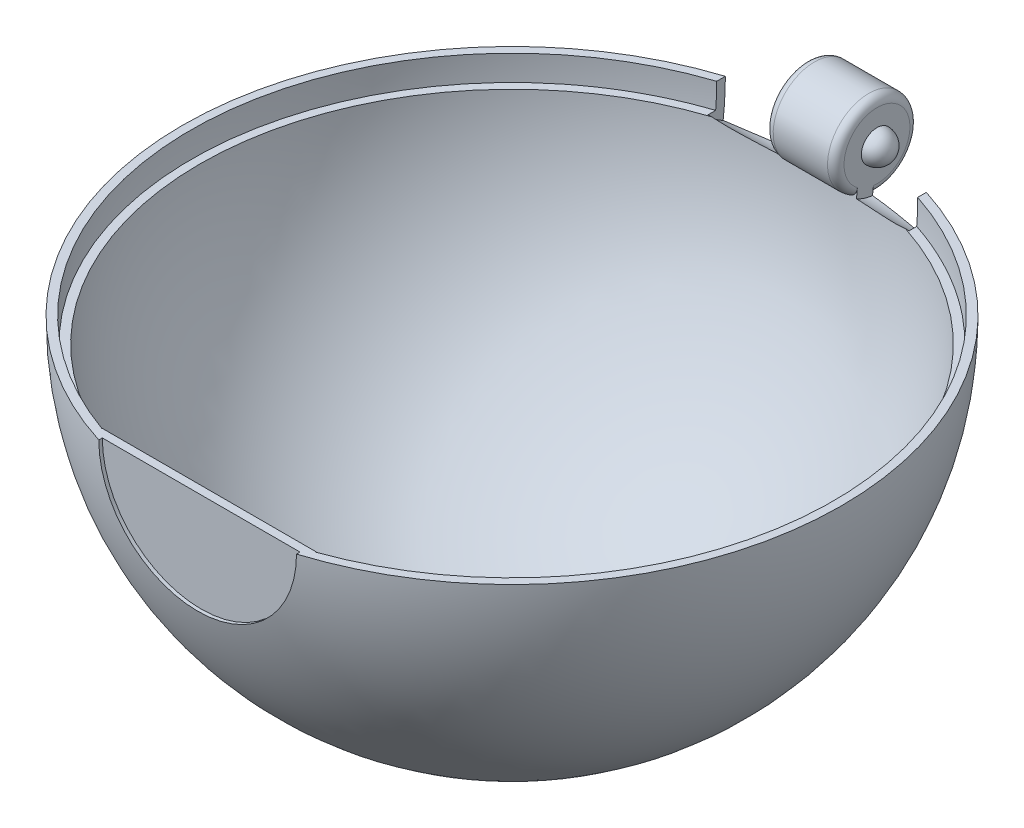
ISO-10303-21;
HEADER;
FILE_DESCRIPTION(('STEP AP214'),'2;1');
FILE_NAME('part.step','',(''),(''),'','','');
FILE_SCHEMA(('AUTOMOTIVE_DESIGN { 1 0 10303 214 1 1 1 1 }'));
ENDSEC;
DATA;
#1=APPLICATION_CONTEXT('core data for automotive mechanical design processes');
#2=APPLICATION_PROTOCOL_DEFINITION('international standard','automotive_design',2000,#1);
#3=PRODUCT_CONTEXT('',#1,'mechanical');
#4=PRODUCT('Part','Part','',(#3));
#5=PRODUCT_RELATED_PRODUCT_CATEGORY('part','',(#4));
#6=PRODUCT_DEFINITION_FORMATION('','',#4);
#7=PRODUCT_DEFINITION_CONTEXT('part definition',#1,'design');
#8=PRODUCT_DEFINITION('design','',#6,#7);
#9=PRODUCT_DEFINITION_SHAPE('','',#8);
#10=(LENGTH_UNIT() NAMED_UNIT(*) SI_UNIT(.MILLI.,.METRE.));
#11=(NAMED_UNIT(*) PLANE_ANGLE_UNIT() SI_UNIT($,.RADIAN.));
#12=(NAMED_UNIT(*) SI_UNIT($,.STERADIAN.) SOLID_ANGLE_UNIT());
#13=UNCERTAINTY_MEASURE_WITH_UNIT(LENGTH_MEASURE(1.E-05),#10,'distance_accuracy_value','');
#14=(GEOMETRIC_REPRESENTATION_CONTEXT(3) GLOBAL_UNCERTAINTY_ASSIGNED_CONTEXT((#13)) GLOBAL_UNIT_ASSIGNED_CONTEXT((#10,
#11,#12)) REPRESENTATION_CONTEXT('',''));
#15=CARTESIAN_POINT('',(0.,0.,0.));
#16=DIRECTION('',(0.,0.,1.));
#17=DIRECTION('',(1.,0.,0.));
#18=AXIS2_PLACEMENT_3D('',#15,#16,#17);
#19=CARTESIAN_POINT('',(12.2,0.,-40.));
#20=DIRECTION('',(-1.,0.,0.));
#21=DIRECTION('',(0.,0.,1.));
#22=AXIS2_PLACEMENT_3D('',#19,#20,#21);
#23=CYLINDRICAL_SURFACE('',#22,5.);
#24=CARTESIAN_POINT('',(-12.2002,-4.50308848326412,-37.8269389995));
#25=CARTESIAN_POINT('',(-11.9978029788796,-4.53286837908402,-37.8886725762478));
#26=CARTESIAN_POINT('',(-11.7946918927189,-4.56046767067175,-37.9490848824753));
#27=CARTESIAN_POINT('',(-11.3871990899398,-4.61175847528687,-38.0671646830625));
#28=CARTESIAN_POINT('',(-11.182817476644,-4.63545030187518,-38.1248323974019));
#29=CARTESIAN_POINT('',(-10.772981780209,-4.67937639575399,-38.2373105963015));
#30=CARTESIAN_POINT('',(-10.5675281062083,-4.69961189499087,-38.2921220940482));
#31=CARTESIAN_POINT('',(-10.1555872190704,-4.73702990258289,-38.3988309760596));
#32=CARTESIAN_POINT('',(-9.94909998135645,-4.7542123379824,-38.4507282906671));
#33=CARTESIAN_POINT('',(-9.32875212664472,-4.80169191712379,-38.6018153853789));
#34=CARTESIAN_POINT('',(-8.91348541270946,-4.82797510119328,-38.6965432388172));
#35=CARTESIAN_POINT('',(-8.07986637585528,-4.87232848053742,-38.8736192314231));
#36=CARTESIAN_POINT('',(-7.66151373954142,-4.89039782964253,-38.9559660945464));
#37=CARTESIAN_POINT('',(-6.83064910080587,-4.92008361099159,-39.1063919448953));
#38=CARTESIAN_POINT('',(-6.4181869278229,-4.93182150519525,-39.1747226447045));
#39=CARTESIAN_POINT('',(-5.59125812798807,-4.95099439805952,-39.2988600394393));
#40=CARTESIAN_POINT('',(-5.17679136627722,-4.95842910304523,-39.3546658794359));
#41=CARTESIAN_POINT('',(-4.34612077072414,-4.97029914935655,-39.4535475234042));
#42=CARTESIAN_POINT('',(-3.92991627665138,-4.9747332214683,-39.4966179361872));
#43=CARTESIAN_POINT('',(-3.09638185349051,-4.9815951328953,-39.5698266550151));
#44=CARTESIAN_POINT('',(-2.67905197770588,-4.98402306561278,-39.599965563096));
#45=CARTESIAN_POINT('',(-1.66010423304868,-4.98838351901832,-39.6575677679463));
#46=CARTESIAN_POINT('',(-1.05807391570866,-4.98962974989821,-39.6780381960944));
#47=CARTESIAN_POINT('',(0.14631129355968,-4.99049316479755,-39.6917661114158));
#48=CARTESIAN_POINT('',(0.748666198931557,-4.99011027516489,-39.6850223682441));
#49=CARTESIAN_POINT('',(1.95251392743705,-4.98737901347728,-39.6443752937921));
#50=CARTESIAN_POINT('',(2.55400666414989,-4.98503045654415,-39.6104694078261));
#51=CARTESIAN_POINT('',(3.75487811173339,-4.97672334475579,-39.5157679227472));
#52=CARTESIAN_POINT('',(4.35425671149382,-4.970764602926,-39.4549709309652));
#53=CARTESIAN_POINT('',(5.56703949555887,-4.95203297150884,-39.3048302243836));
#54=CARTESIAN_POINT('',(6.18034430745905,-4.93906684943935,-39.2147073348568));
#55=CARTESIAN_POINT('',(7.40194251108421,-4.90160126744073,-39.0073019452967));
#56=CARTESIAN_POINT('',(8.01023673073821,-4.87710375345122,-38.8900240294107));
#57=CARTESIAN_POINT('',(8.91789107693872,-4.82703277877957,-38.6945365443468));
#58=CARTESIAN_POINT('',(9.21975138232124,-4.80811255247212,-38.6260844028411));
#59=CARTESIAN_POINT('',(9.82156797546881,-4.76485412578124,-38.4828415793072));
#60=CARTESIAN_POINT('',(10.1215243616813,-4.74051620792088,-38.4080512279315));
#61=CARTESIAN_POINT('',(10.7194449770357,-4.68533411448251,-38.2522862534166));
#62=CARTESIAN_POINT('',(11.0174077868696,-4.65448572644152,-38.1713076480431));
#63=CARTESIAN_POINT('',(11.610809366724,-4.58497548980691,-38.0034660312702));
#64=CARTESIAN_POINT('',(11.9062476516111,-4.54631217312831,-37.9166019162809));
#65=CARTESIAN_POINT('',(12.2002,-4.50308848326412,-37.8269389995));
#66=B_SPLINE_CURVE_WITH_KNOTS('',3,(#24,#25,#26,#27,#28,#29,#30,#31,#32,#33,#34,#35,#36,#37,#38,
#39,#40,#41,#42,#43,#44,#45,#46,#47,#48,#49,#50,#51,#52,#53,#54,#55,#56,#57,#58,#59,#60,#61,#62,
#63,#64,#65),.UNSPECIFIED.,.F.,.F.,(4,2,2,2,2,2,2,2,2,2,2,2,2,2,2,2,2,2,2,2,4),(0.,
0.641033090661753,1.28201471551866,1.9227673949491,2.56353538366316,3.84344675260549,
5.12348994507679,6.37801460615139,7.63262487326515,8.88776548686364,10.1428476600863,
11.9493361069008,13.7559062254524,15.562646277608,17.3694799103701,19.2288886873964,
21.0879837988397,22.0181943870335,22.948356477742,23.8791222656091,24.8100630666374),.UNSPECIFIED.);
#67=CARTESIAN_POINT('',(-3.3,-4.97983288970373,-39.551375));
#68=VERTEX_POINT('',#67);
#69=CARTESIAN_POINT('',(3.30000000000005,-4.97983288970373,-39.551375));
#70=VERTEX_POINT('',#69);
#71=EDGE_CURVE('E193',#68,#70,#66,.T.);
#72=ORIENTED_EDGE('',*,*,#71,.F.);
#73=CARTESIAN_POINT('',(-3.3,0.,-40.));
#74=DIRECTION('',(-1.,0.,0.));
#75=DIRECTION('',(0.,0.,1.));
#76=AXIS2_PLACEMENT_3D('',#73,#74,#75);
#77=CIRCLE('',#76,5.);
#78=CARTESIAN_POINT('',(-3.3,-4.3870944951515,-37.601375));
#79=VERTEX_POINT('',#78);
#80=EDGE_CURVE('E340',#68,#79,#77,.F.);
#81=ORIENTED_EDGE('',*,*,#80,.T.);
#82=CARTESIAN_POINT('',(11.7903349984224,-2.9998,-35.9998500078122));
#83=CARTESIAN_POINT('',(11.6698033300417,-3.0471598250967,-36.0353791801273));
#84=CARTESIAN_POINT('',(11.5483800586359,-3.09242161682977,-36.0706235210669));
#85=CARTESIAN_POINT('',(11.3040092507102,-3.17912423608989,-36.1404283719454));
#86=CARTESIAN_POINT('',(11.1810620199323,-3.22056581640321,-36.1749890155504));
#87=CARTESIAN_POINT('',(10.9339631091742,-3.2999865908136,-36.2432963815458));
#88=CARTESIAN_POINT('',(10.8098125830959,-3.33796879679888,-36.2770437927743));
#89=CARTESIAN_POINT('',(10.5603700243437,-3.41082631607986,-36.3436768030209));
#90=CARTESIAN_POINT('',(10.4350779280139,-3.4457014549376,-36.376562353579));
#91=CARTESIAN_POINT('',(10.0585133967373,-3.54587894896994,-36.4736145395899));
#92=CARTESIAN_POINT('',(9.80575952825097,-3.60698389207323,-36.5363963362957));
#93=CARTESIAN_POINT('',(9.2971458794444,-3.71979454619215,-36.6578474449789));
#94=CARTESIAN_POINT('',(9.04128529779213,-3.77149777476517,-36.7165156682971));
#95=CARTESIAN_POINT('',(8.52652437989094,-3.86701367941325,-36.8295597284223));
#96=CARTESIAN_POINT('',(8.26761839203428,-3.91080787397449,-36.8839253488572));
#97=CARTESIAN_POINT('',(7.74783782893644,-3.99150061183316,-36.9879819138669));
#98=CARTESIAN_POINT('',(7.48696345124716,-4.02839983779433,-37.0376733209885));
#99=CARTESIAN_POINT('',(6.96328279501771,-4.09627856809895,-37.1322665758857));
#100=CARTESIAN_POINT('',(6.7004746980753,-4.12725147641322,-37.1771630626193));
#101=CARTESIAN_POINT('',(6.1734911427201,-4.18399024732575,-37.261968209471));
#102=CARTESIAN_POINT('',(5.90931561902369,-4.20975585892152,-37.3018766291186));
#103=CARTESIAN_POINT('',(5.16574157069302,-4.27571780361929,-37.4068037267221));
#104=CARTESIAN_POINT('',(4.68504978570031,-4.3107352133623,-37.4660313815532));
#105=CARTESIAN_POINT('',(3.72111544160694,-4.36868940836409,-37.5673210327274));
#106=CARTESIAN_POINT('',(3.23787258543864,-4.39162475388225,-37.609380983173));
#107=CARTESIAN_POINT('',(2.26974114930442,-4.42725703227333,-37.6760327102672));
#108=CARTESIAN_POINT('',(1.78485234649039,-4.43995251830193,-37.7006220183372));
#109=CARTESIAN_POINT('',(0.814375308649447,-4.45613969649372,-37.7321530792812));
#110=CARTESIAN_POINT('',(0.328787107520528,-4.45963182063351,-37.7390956604359));
#111=CARTESIAN_POINT('',(-0.642152940387285,-4.4577007565397,-37.7352906012965));
#112=CARTESIAN_POINT('',(-1.1275048138938,-4.45228031455511,-37.7245484102497));
#113=CARTESIAN_POINT('',(-2.09733422536389,-4.43208368688598,-37.6854541721994));
#114=CARTESIAN_POINT('',(-2.58181171778236,-4.41730702719621,-37.6571012330004));
#115=CARTESIAN_POINT('',(-3.54890922177293,-4.37719401082197,-37.5829878967798));
#116=CARTESIAN_POINT('',(-4.03152955552542,-4.35185957753959,-37.5372306705819));
#117=CARTESIAN_POINT('',(-4.99399365465959,-4.28860228178709,-37.4286438976279));
#118=CARTESIAN_POINT('',(-5.47383778239285,-4.25068110166096,-37.3658166326559));
#119=CARTESIAN_POINT('',(-6.20311238741468,-4.18085971246856,-37.2573083611495));
#120=CARTESIAN_POINT('',(-6.45399340907656,-4.15461968383785,-37.2176075046779));
#121=CARTESIAN_POINT('',(-6.95443514021589,-4.09720526923058,-37.1337302693361));
#122=CARTESIAN_POINT('',(-7.20399591334169,-4.06603112340673,-37.0895541083251));
#123=CARTESIAN_POINT('',(-7.70130037776527,-3.99808302120815,-36.9968967824771));
#124=CARTESIAN_POINT('',(-7.94904559693803,-3.96131452647966,-36.9484198354456));
#125=CARTESIAN_POINT('',(-8.44261892102779,-3.88131035256274,-36.8472885041526));
#126=CARTESIAN_POINT('',(-8.68844717696272,-3.83807518834481,-36.7946344526896));
#127=CARTESIAN_POINT('',(-9.17736284429919,-3.74418343577812,-36.6854457503672));
#128=CARTESIAN_POINT('',(-9.42045427552118,-3.69353987161528,-36.6289180004373));
#129=CARTESIAN_POINT('',(-9.90370929069853,-3.58351660856111,-36.5121863899989));
#130=CARTESIAN_POINT('',(-10.1438735615828,-3.52413900379851,-36.4519834127046));
#131=CARTESIAN_POINT('',(-10.6212808452806,-3.39484610278541,-36.3280688545775));
#132=CARTESIAN_POINT('',(-10.858513234466,-3.32490043483353,-36.2643475085096));
#133=CARTESIAN_POINT('',(-11.2108276949945,-3.21058477352361,-36.1666395299786));
#134=CARTESIAN_POINT('',(-11.3277255970325,-3.17089455302755,-36.1337014733556));
#135=CARTESIAN_POINT('',(-11.5601295330384,-3.08803847941264,-36.0672115739014));
#136=CARTESIAN_POINT('',(-11.6756353168284,-3.04487201197586,-36.0336596233967));
#137=CARTESIAN_POINT('',(-11.7903349984224,-2.9998,-35.9998500078122));
#138=B_SPLINE_CURVE_WITH_KNOTS('',3,(#82,#83,#84,#85,#86,#87,#88,#89,#90,#91,#92,#93,#94,#95,
#96,#97,#98,#99,#100,#101,#102,#103,#104,#105,#106,#107,#108,#109,#110,#111,#112,#113,#114,#115,
#116,#117,#118,#119,#120,#121,#122,#123,#124,#125,#126,#127,#128,#129,#130,#131,#132,#133,#134,
#135,#136,#137),.UNSPECIFIED.,.F.,.F.,(4,2,2,2,2,2,2,2,2,2,2,2,2,2,2,2,2,2,2,2,2,2,2,2,2,2,2,4),
(0.,0.402821189354174,0.805562830913803,1.20795040670183,1.61036055924332,2.41260263047595,
3.2150562202793,4.01936135004418,4.82358680414326,5.62870222482475,6.43385644448579,
7.89009303658112,9.3465031196424,10.8031189506139,12.259666411442,13.7157651471317,
15.171937657681,16.6278450004192,18.0835578249579,18.8495477914137,19.6155004871658,
20.3807101413785,21.1458588908537,21.9096783016374,22.6733148718777,23.4391893481291,
23.8224514298369,24.2057813903864),.UNSPECIFIED.);
#139=CARTESIAN_POINT('',(3.3,-4.38709449515069,-37.601375));
#140=VERTEX_POINT('',#139);
#141=EDGE_CURVE('E357',#140,#79,#138,.T.);
#142=ORIENTED_EDGE('',*,*,#141,.F.);
#143=CARTESIAN_POINT('',(3.3,0.,-40.));
#144=DIRECTION('',(1.,0.,0.));
#145=DIRECTION('',(0.,0.,-1.));
#146=AXIS2_PLACEMENT_3D('',#143,#144,#145);
#147=CIRCLE('',#146,5.);
#148=EDGE_CURVE('E177',#140,#70,#147,.F.);
#149=ORIENTED_EDGE('',*,*,#148,.T.);
#150=EDGE_LOOP('',(#72,#81,#142,#149));
#151=FACE_BOUND('',#150,.T.);
#152=ADVANCED_FACE('F35',(#151),#23,.T.);
#153=CARTESIAN_POINT('',(0.,0.,0.));
#154=DIRECTION('',(0.,1.,0.));
#155=DIRECTION('',(-1.,0.,0.));
#156=AXIS2_PLACEMENT_3D('',#153,#154,#155);
#157=SPHERICAL_SURFACE('',#156,38.);
#158=CARTESIAN_POINT('',(0.,-3.,0.));
#159=DIRECTION('',(0.,1.,0.));
#160=DIRECTION('',(-1.,0.,0.));
#161=AXIS2_PLACEMENT_3D('',#158,#159,#160);
#162=CIRCLE('',#161,37.8813938497516);
#163=CARTESIAN_POINT('',(9.26926824772571,-2.99999999999999,36.7298334620742));
#164=VERTEX_POINT('',#163);
#165=CARTESIAN_POINT('',(11.7898261225516,-2.99999999999999,-36.));
#166=VERTEX_POINT('',#165);
#167=EDGE_CURVE('E316',#164,#166,#162,.T.);
#168=ORIENTED_EDGE('',*,*,#167,.T.);
#169=CARTESIAN_POINT('',(4.3,-4.33380137516419,-37.506375));
#170=VERTEX_POINT('',#169);
#171=EDGE_CURVE('E199',#166,#170,#138,.T.);
#172=ORIENTED_EDGE('',*,*,#171,.T.);
#173=CARTESIAN_POINT('',(4.3,0.,0.));
#174=DIRECTION('',(1.,0.,0.));
#175=DIRECTION('',(0.,0.,-1.));
#176=AXIS2_PLACEMENT_3D('',#173,#174,#175);
#177=CIRCLE('',#176,37.7559266870779);
#178=CARTESIAN_POINT('',(4.3,-3.21406965300614,-37.618875));
#179=VERTEX_POINT('',#178);
#180=EDGE_CURVE('E345',#179,#170,#177,.F.);
#181=ORIENTED_EDGE('',*,*,#180,.F.);
#182=CARTESIAN_POINT('',(4.3,-3.21406965300614,-37.618875));
#183=CARTESIAN_POINT('',(4.29999382443238,-3.25651700977552,-37.6152490129872));
#184=CARTESIAN_POINT('',(4.29802484314803,-3.29895297765944,-37.6117760717146));
#185=CARTESIAN_POINT('',(4.29007587705306,-3.38351288913631,-37.6051713269596));
#186=CARTESIAN_POINT('',(4.28409213746157,-3.42563650328096,-37.6020398460161));
#187=CARTESIAN_POINT('',(4.259936455678,-3.5512934407331,-37.5931983320945));
#188=CARTESIAN_POINT('',(4.23555874504061,-3.63379363610894,-37.5880686571521));
#189=CARTESIAN_POINT('',(4.17471510925077,-3.78127377876868,-37.5803036705264));
#190=CARTESIAN_POINT('',(4.14033942479608,-3.84711177273264,-37.5774242771402));
#191=CARTESIAN_POINT('',(4.05974704163706,-3.97098879315224,-37.5733301145246));
#192=CARTESIAN_POINT('',(4.01356634695863,-4.02905072941296,-37.5721103538741));
#193=CARTESIAN_POINT('',(3.91642802635173,-4.12855281618873,-37.5715438383654));
#194=CARTESIAN_POINT('',(3.86664673671067,-4.1711399759873,-37.5719961453405));
#195=CARTESIAN_POINT('',(3.759982235363,-4.24617223042275,-37.5744168478942));
#196=CARTESIAN_POINT('',(3.70310425260987,-4.27862473139152,-37.5763841326771));
#197=CARTESIAN_POINT('',(3.58953809052785,-4.32922126338777,-37.5815987520888));
#198=CARTESIAN_POINT('',(3.53331065587849,-4.34840438465699,-37.584712184462));
#199=CARTESIAN_POINT('',(3.44703057755485,-4.36910767360939,-37.5902881817167));
#200=CARTESIAN_POINT('',(3.41787337144141,-4.37466718218401,-37.5923038971846));
#201=CARTESIAN_POINT('',(3.35916829677394,-4.38299417213709,-37.5966253001039));
#202=CARTESIAN_POINT('',(3.32962022280344,-4.38576012111716,-37.5989311459264));
#203=CARTESIAN_POINT('',(3.29999999999991,-4.38709449514996,-37.601375));
#204=B_SPLINE_CURVE_WITH_KNOTS('',3,(#182,#183,#184,#185,#186,#187,#188,#189,#190,#191,#192,
#193,#194,#195,#196,#197,#198,#199,#200,#201,#202,#203),.UNSPECIFIED.,.F.,.F.,(4,2,2,2,2,2,2,2,
2,2,4),(0.,0.12770668850595,0.255532980792207,0.51213124057193,0.73389585310546,
0.954992013101567,1.15042953315756,1.34572389291169,1.52311225894718,1.61224541709812,
1.70142744245235),.UNSPECIFIED.);
#205=EDGE_CURVE('E267',#179,#140,#204,.T.);
#206=ORIENTED_EDGE('',*,*,#205,.T.);
#207=ORIENTED_EDGE('',*,*,#141,.T.);
#208=CARTESIAN_POINT('',(-3.3,-4.38709449515032,-37.6013750000007));
#209=CARTESIAN_POINT('',(-3.32703791165509,-4.38587571700161,-37.5991442768735));
#210=CARTESIAN_POINT('',(-3.35401640371349,-4.38346523636181,-37.5970283737952));
#211=CARTESIAN_POINT('',(-3.40767099422426,-4.37630895880681,-37.5930370576477));
#212=CARTESIAN_POINT('',(-3.43434719045824,-4.37156394044494,-37.5911615646659));
#213=CARTESIAN_POINT('',(-3.51344515152222,-4.35394775215863,-37.5859250113478));
#214=CARTESIAN_POINT('',(-3.56517346224961,-4.33768398896727,-37.5829343906204));
#215=CARTESIAN_POINT('',(-3.66518888730634,-4.29684776763609,-37.5780044116089));
#216=CARTESIAN_POINT('',(-3.71347893765929,-4.27228250394345,-37.5760641468155));
#217=CARTESIAN_POINT('',(-3.80559071767481,-4.21577275598482,-37.5732306570219));
#218=CARTESIAN_POINT('',(-3.84940942909263,-4.1838233341429,-37.572338135056));
#219=CARTESIAN_POINT('',(-3.9336248738616,-4.11196044744337,-37.57155286815));
#220=CARTESIAN_POINT('',(-3.97375971753678,-4.07174046490814,-37.5717096949507));
#221=CARTESIAN_POINT('',(-4.0474329290686,-3.9856948463685,-37.5730719251486));
#222=CARTESIAN_POINT('',(-4.08097033495082,-3.93986839446075,-37.5742774813226));
#223=CARTESIAN_POINT('',(-4.14382538153291,-3.83941383325623,-37.5778051967758));
#224=CARTESIAN_POINT('',(-4.17246195112133,-3.78436356174225,-37.5802206510116));
#225=CARTESIAN_POINT('',(-4.22112968146229,-3.67060143331793,-37.5860691101143));
#226=CARTESIAN_POINT('',(-4.24115311014913,-3.6118863403864,-37.589503024607));
#227=CARTESIAN_POINT('',(-4.27133871715552,-3.49687370479463,-37.5969521155236));
#228=CARTESIAN_POINT('',(-4.28214040596396,-3.44073707222656,-37.6009023529434));
#229=CARTESIAN_POINT('',(-4.29646576387753,-3.32773862252015,-37.6094377141561));
#230=CARTESIAN_POINT('',(-4.30000881030946,-3.27087914494319,-37.6140211126412));
#231=CARTESIAN_POINT('',(-4.3,-3.21406965300614,-37.618875));
#232=B_SPLINE_CURVE_WITH_KNOTS('',3,(#208,#209,#210,#211,#212,#213,#214,#215,#216,#217,#218,
#219,#220,#221,#222,#223,#224,#225,#226,#227,#228,#229,#230,#231),.UNSPECIFIED.,.F.,.F.,(4,2,2,
2,2,2,2,2,2,2,2,4),(0.,0.0814162794866248,0.162805425553017,0.324878590731014,0.486811654826631,
0.648853313830078,0.818602197335693,0.988375813661809,1.17391511739507,1.3596206349705,
1.53105659382661,1.70203429587768),.UNSPECIFIED.);
#233=CARTESIAN_POINT('',(-4.3,-3.21406965300614,-37.618875));
#234=VERTEX_POINT('',#233);
#235=EDGE_CURVE('E262',#79,#234,#232,.T.);
#236=ORIENTED_EDGE('',*,*,#235,.T.);
#237=CARTESIAN_POINT('',(-4.3,0.,0.));
#238=DIRECTION('',(-1.,0.,0.));
#239=DIRECTION('',(0.,0.,1.));
#240=AXIS2_PLACEMENT_3D('',#237,#238,#239);
#241=CIRCLE('',#240,37.7559266870779);
#242=CARTESIAN_POINT('',(-4.3,-4.33380137516418,-37.506375));
#243=VERTEX_POINT('',#242);
#244=EDGE_CURVE('E59',#243,#234,#241,.F.);
#245=ORIENTED_EDGE('',*,*,#244,.F.);
#246=CARTESIAN_POINT('',(-11.7903349984224,-2.9998,-35.9998500078122));
#247=CARTESIAN_POINT('',(-11.6691380475539,-3.04742099203127,-36.0355753079614));
#248=CARTESIAN_POINT('',(-11.5470398465165,-3.09292095757785,-36.0710125306087));
#249=CARTESIAN_POINT('',(-11.3013038487719,-3.18005975673175,-36.1411949094595));
#250=CARTESIAN_POINT('',(-11.1776663648314,-3.22169936065738,-36.1759402026432));
#251=CARTESIAN_POINT('',(-10.9291750439418,-3.30148209495969,-36.2446070656288));
#252=CARTESIAN_POINT('',(-10.8043223687197,-3.33962825946002,-36.2785293310551));
#253=CARTESIAN_POINT('',(-10.5534655366275,-3.41278430140594,-36.3455012676502));
#254=CARTESIAN_POINT('',(-10.4274613148218,-3.44779400076871,-36.3785508891967));
#255=CARTESIAN_POINT('',(-10.0485803053832,-3.54838211223125,-36.4761211674621));
#256=CARTESIAN_POINT('',(-9.79420734819202,-3.60971758762884,-36.5392370189917));
#257=CARTESIAN_POINT('',(-9.28233206055996,-3.72289991659264,-36.6612982572897));
#258=CARTESIAN_POINT('',(-9.02482894761213,-3.77474434321618,-36.7202425750041));
#259=CARTESIAN_POINT('',(-8.50977634482349,-3.86991622036752,-36.8331175693571));
#260=CARTESIAN_POINT('',(-8.2522497694516,-3.91331872454189,-36.8870899457536));
#261=CARTESIAN_POINT('',(-7.73524932099287,-3.99332304168566,-36.9904092594759));
#262=CARTESIAN_POINT('',(-7.47577559229701,-4.02992535383799,-37.0397565361855));
#263=CARTESIAN_POINT('',(-6.95510594812041,-4.09726016898304,-37.13367882619));
#264=CARTESIAN_POINT('',(-6.69390938694002,-4.12799032465693,-37.1782519279543));
#265=CARTESIAN_POINT('',(-6.17018119014927,-4.18431405196285,-37.2624679072205));
#266=CARTESIAN_POINT('',(-5.90764960293854,-4.20990780846613,-37.3021109621471));
#267=CARTESIAN_POINT('',(-5.53296321013861,-4.24314005928199,-37.3549847308101));
#268=CARTESIAN_POINT('',(-5.42125723668833,-4.25263210603331,-37.3702808748761));
#269=CARTESIAN_POINT('',(-5.19768274458077,-4.27084087316866,-37.3999573356708));
#270=CARTESIAN_POINT('',(-5.0858142628707,-4.27955774812629,-37.4143378348211));
#271=CARTESIAN_POINT('',(-4.86168925394983,-4.2962727645456,-37.4422070016208));
#272=CARTESIAN_POINT('',(-4.74943239583379,-4.30426946515099,-37.4556938677341));
#273=CARTESIAN_POINT('',(-4.52474066070002,-4.31956047543175,-37.4817418455793));
#274=CARTESIAN_POINT('',(-4.41230575257541,-4.32685464434424,-37.4943027716672));
#275=CARTESIAN_POINT('',(-4.2998,-4.33381374568568,-37.5063964995));
#276=B_SPLINE_CURVE_WITH_KNOTS('',3,(#246,#247,#248,#249,#250,#251,#252,#253,#254,#255,#256,
#257,#258,#259,#260,#261,#262,#263,#264,#265,#266,#267,#268,#269,#270,#271,#272,#273,#274,#275),
.UNSPECIFIED.,.F.,.F.,(4,2,2,2,2,2,2,2,2,2,2,2,2,2,4),(0.,0.405043815993187,0.810006632506191,
1.21461432707938,1.61924498000539,2.42646583204607,3.23389280994859,4.03377544943886,
4.83359934857905,5.63374230123474,6.43385644966898,6.77329341266005,7.11266253753095,
7.45269621821546,7.79279788868625),.UNSPECIFIED.);
#277=CARTESIAN_POINT('',(-11.7898261225516,-3.,-36.));
#278=VERTEX_POINT('',#277);
#279=EDGE_CURVE('E185',#278,#243,#276,.T.);
#280=ORIENTED_EDGE('',*,*,#279,.F.);
#281=CARTESIAN_POINT('',(-9.26926824772575,-3.,36.7298334620742));
#282=VERTEX_POINT('',#281);
#283=EDGE_CURVE('E392',#278,#282,#162,.T.);
#284=ORIENTED_EDGE('',*,*,#283,.T.);
#285=CARTESIAN_POINT('',(0.,0.,36.7298334620742));
#286=DIRECTION('',(0.,0.,1.));
#287=DIRECTION('',(1.,0.,0.));
#288=AXIS2_PLACEMENT_3D('',#285,#286,#287);
#289=CIRCLE('',#288,9.74265537973592);
#290=EDGE_CURVE('E384',#282,#164,#289,.T.);
#291=ORIENTED_EDGE('',*,*,#290,.T.);
#292=EDGE_LOOP('',(#168,#172,#181,#206,#207,#236,#245,#280,#284,#291));
#293=FACE_BOUND('',#292,.T.);
#294=ADVANCED_FACE('F219',(#293),#157,.F.);
#295=CARTESIAN_POINT('',(0.,0.,0.));
#296=DIRECTION('',(0.,0.,-1.));
#297=DIRECTION('',(1.,0.,0.));
#298=AXIS2_PLACEMENT_3D('',#295,#296,#297);
#299=SPHERICAL_SURFACE('',#298,39.);
#300=CARTESIAN_POINT('',(-12.2,0.,0.));
#301=DIRECTION('',(1.,0.,0.));
#302=DIRECTION('',(0.,0.,-1.));
#303=AXIS2_PLACEMENT_3D('',#300,#301,#302);
#304=CIRCLE('',#303,37.0426780889287);
#305=CARTESIAN_POINT('',(-12.2,0.,-37.0426780889287));
#306=VERTEX_POINT('',#305);
#307=CARTESIAN_POINT('',(-12.2,-2.99999999999998,-36.9209967362746));
#308=VERTEX_POINT('',#307);
#309=EDGE_CURVE('E367',#306,#308,#304,.F.);
#310=ORIENTED_EDGE('',*,*,#309,.F.);
#311=CARTESIAN_POINT('',(0.,0.,0.));
#312=DIRECTION('',(0.,1.,0.));
#313=DIRECTION('',(0.,0.,1.));
#314=AXIS2_PLACEMENT_3D('',#311,#312,#313);
#315=CIRCLE('',#314,39.);
#316=CARTESIAN_POINT('',(-13.,0.,36.7695526217005));
#317=VERTEX_POINT('',#316);
#318=EDGE_CURVE('E313',#306,#317,#315,.T.);
#319=ORIENTED_EDGE('',*,*,#318,.T.);
#320=CARTESIAN_POINT('',(0.,0.,36.7695526217005));
#321=DIRECTION('',(0.,0.,-1.));
#322=DIRECTION('',(-1.,0.,0.));
#323=AXIS2_PLACEMENT_3D('',#320,#321,#322);
#324=CIRCLE('',#323,13.);
#325=CARTESIAN_POINT('',(-12.6491106406735,-2.99999999999998,36.7695526217005));
#326=VERTEX_POINT('',#325);
#327=EDGE_CURVE('E410',#317,#326,#324,.F.);
#328=ORIENTED_EDGE('',*,*,#327,.T.);
#329=CARTESIAN_POINT('',(0.,-2.99999999999998,0.));
#330=DIRECTION('',(0.,1.,0.));
#331=DIRECTION('',(-1.,0.,0.));
#332=AXIS2_PLACEMENT_3D('',#329,#330,#331);
#333=CIRCLE('',#332,38.8844441904471);
#334=EDGE_CURVE('E383',#308,#326,#333,.T.);
#335=ORIENTED_EDGE('',*,*,#334,.F.);
#336=EDGE_LOOP('',(#310,#319,#328,#335));
#337=FACE_BOUND('',#336,.T.);
#338=ADVANCED_FACE('F246',(#337),#299,.F.);
#339=CARTESIAN_POINT('',(-38.8844441904472,-2.99999999999999,0.));
#340=DIRECTION('',(0.,1.,0.));
#341=DIRECTION('',(-1.,0.,0.));
#342=AXIS2_PLACEMENT_3D('',#339,#340,#341);
#343=PLANE('',#342);
#344=DIRECTION('',(0.,0.,-1.));
#345=VECTOR('',#344,1.);
#346=CARTESIAN_POINT('',(12.2,-2.99999999999999,0.));
#347=LINE('',#346,#345);
#348=CARTESIAN_POINT('',(12.2,-2.99999999999999,-36.));
#349=VERTEX_POINT('',#348);
#350=CARTESIAN_POINT('',(12.2,-2.99999999999998,-36.9209967362746));
#351=VERTEX_POINT('',#350);
#352=EDGE_CURVE('E334',#349,#351,#347,.T.);
#353=ORIENTED_EDGE('',*,*,#352,.F.);
#354=DIRECTION('',(-1.,0.,0.));
#355=VECTOR('',#354,1.);
#356=CARTESIAN_POINT('',(12.2,-2.99999999999999,-36.));
#357=LINE('',#356,#355);
#358=EDGE_CURVE('E335',#349,#166,#357,.T.);
#359=ORIENTED_EDGE('',*,*,#358,.T.);
#360=ORIENTED_EDGE('',*,*,#167,.F.);
#361=DIRECTION('',(1.,0.,0.));
#362=VECTOR('',#361,1.);
#363=CARTESIAN_POINT('',(-38.8844441904472,-2.99999999999999,36.7298334620742));
#364=LINE('',#363,#362);
#365=CARTESIAN_POINT('',(12.6491106406735,-2.99999999999999,36.7298334620742));
#366=VERTEX_POINT('',#365);
#367=EDGE_CURVE('E319',#164,#366,#364,.T.);
#368=ORIENTED_EDGE('',*,*,#367,.T.);
#369=DIRECTION('',(0.,0.,-1.));
#370=VECTOR('',#369,1.);
#371=CARTESIAN_POINT('',(12.6491106406735,-2.99999999999999,37.7298334620742));
#372=LINE('',#371,#370);
#373=CARTESIAN_POINT('',(12.6491106406735,-2.99999999999998,36.7695526217005));
#374=VERTEX_POINT('',#373);
#375=EDGE_CURVE('E325',#374,#366,#372,.T.);
#376=ORIENTED_EDGE('',*,*,#375,.F.);
#377=EDGE_CURVE('E386',#374,#351,#333,.T.);
#378=ORIENTED_EDGE('',*,*,#377,.T.);
#379=EDGE_LOOP('',(#353,#359,#360,#368,#376,#378));
#380=FACE_BOUND('',#379,.T.);
#381=ADVANCED_FACE('F243',(#380),#343,.T.);
#382=ORIENTED_EDGE('',*,*,#283,.F.);
#383=CARTESIAN_POINT('',(-12.2,-2.99999999999999,-36.));
#384=VERTEX_POINT('',#383);
#385=EDGE_CURVE('E331',#278,#384,#357,.T.);
#386=ORIENTED_EDGE('',*,*,#385,.T.);
#387=DIRECTION('',(0.,0.,-1.));
#388=VECTOR('',#387,1.);
#389=CARTESIAN_POINT('',(-12.2,-2.99999999999999,0.));
#390=LINE('',#389,#388);
#391=EDGE_CURVE('E328',#384,#308,#390,.T.);
#392=ORIENTED_EDGE('',*,*,#391,.T.);
#393=ORIENTED_EDGE('',*,*,#334,.T.);
#394=DIRECTION('',(0.,0.,-1.));
#395=VECTOR('',#394,1.);
#396=CARTESIAN_POINT('',(-12.6491106406735,-2.99999999999999,37.7298334620742));
#397=LINE('',#396,#395);
#398=CARTESIAN_POINT('',(-12.6491106406735,-2.99999999999999,36.7298334620742));
#399=VERTEX_POINT('',#398);
#400=EDGE_CURVE('E322',#399,#326,#397,.F.);
#401=ORIENTED_EDGE('',*,*,#400,.F.);
#402=EDGE_CURVE('E321',#399,#282,#364,.T.);
#403=ORIENTED_EDGE('',*,*,#402,.T.);
#404=EDGE_LOOP('',(#382,#386,#392,#393,#401,#403));
#405=FACE_BOUND('',#404,.T.);
#406=ADVANCED_FACE('F245',(#405),#343,.T.);
#407=CARTESIAN_POINT('',(-40.,0.,0.));
#408=DIRECTION('',(0.,1.,0.));
#409=DIRECTION('',(0.,0.,1.));
#410=AXIS2_PLACEMENT_3D('',#407,#408,#409);
#411=PLANE('',#410);
#412=DIRECTION('',(0.,0.,-1.));
#413=VECTOR('',#412,1.);
#414=CARTESIAN_POINT('',(12.2,0.,0.));
#415=LINE('',#414,#413);
#416=CARTESIAN_POINT('',(12.2,0.,-37.0426780889287));
#417=VERTEX_POINT('',#416);
#418=CARTESIAN_POINT('',(12.2,0.,-38.0940940304399));
#419=VERTEX_POINT('',#418);
#420=EDGE_CURVE('E294',#417,#419,#415,.T.);
#421=ORIENTED_EDGE('',*,*,#420,.F.);
#422=CARTESIAN_POINT('',(13.,0.,36.7695526217005));
#423=VERTEX_POINT('',#422);
#424=EDGE_CURVE('E297',#423,#417,#315,.T.);
#425=ORIENTED_EDGE('',*,*,#424,.F.);
#426=DIRECTION('',(0.,0.,-1.));
#427=VECTOR('',#426,1.);
#428=CARTESIAN_POINT('',(13.,0.,37.7298334620742));
#429=LINE('',#428,#427);
#430=CARTESIAN_POINT('',(13.,0.,36.7298334620742));
#431=VERTEX_POINT('',#430);
#432=EDGE_CURVE('E409',#423,#431,#429,.T.);
#433=ORIENTED_EDGE('',*,*,#432,.T.);
#434=DIRECTION('',(-1.,0.,0.));
#435=VECTOR('',#434,1.);
#436=CARTESIAN_POINT('',(-12.,0.,36.7298334620742));
#437=LINE('',#436,#435);
#438=CARTESIAN_POINT('',(-13.,0.,36.7298334620742));
#439=VERTEX_POINT('',#438);
#440=EDGE_CURVE('E389',#431,#439,#437,.T.);
#441=ORIENTED_EDGE('',*,*,#440,.T.);
#442=DIRECTION('',(0.,0.,-1.));
#443=VECTOR('',#442,1.);
#444=CARTESIAN_POINT('',(-13.,0.,37.7298334620742));
#445=LINE('',#444,#443);
#446=EDGE_CURVE('E406',#317,#439,#445,.T.);
#447=ORIENTED_EDGE('',*,*,#446,.F.);
#448=ORIENTED_EDGE('',*,*,#318,.F.);
#449=DIRECTION('',(0.,0.,-1.));
#450=VECTOR('',#449,1.);
#451=CARTESIAN_POINT('',(-12.2,0.,0.));
#452=LINE('',#451,#450);
#453=CARTESIAN_POINT('',(-12.2,0.,-38.0940940304399));
#454=VERTEX_POINT('',#453);
#455=EDGE_CURVE('E364',#306,#454,#452,.T.);
#456=ORIENTED_EDGE('',*,*,#455,.T.);
#457=CARTESIAN_POINT('',(0.,0.,0.));
#458=DIRECTION('',(0.,1.,0.));
#459=DIRECTION('',(0.,0.,1.));
#460=AXIS2_PLACEMENT_3D('',#457,#458,#459);
#461=CIRCLE('',#460,40.);
#462=CARTESIAN_POINT('',(-12.,0.,38.1575680566778));
#463=VERTEX_POINT('',#462);
#464=EDGE_CURVE('E312',#454,#463,#461,.T.);
#465=ORIENTED_EDGE('',*,*,#464,.T.);
#466=DIRECTION('',(0.,0.,1.));
#467=VECTOR('',#466,1.);
#468=CARTESIAN_POINT('',(-12.,0.,37.7298334620742));
#469=LINE('',#468,#467);
#470=CARTESIAN_POINT('',(-12.,0.,37.7298334620742));
#471=VERTEX_POINT('',#470);
#472=EDGE_CURVE('E408',#471,#463,#469,.T.);
#473=ORIENTED_EDGE('',*,*,#472,.F.);
#474=DIRECTION('',(-1.,0.,0.));
#475=VECTOR('',#474,1.);
#476=CARTESIAN_POINT('',(-12.,0.,37.7298334620742));
#477=LINE('',#476,#475);
#478=CARTESIAN_POINT('',(12.,0.,37.7298334620742));
#479=VERTEX_POINT('',#478);
#480=EDGE_CURVE('E417',#479,#471,#477,.T.);
#481=ORIENTED_EDGE('',*,*,#480,.F.);
#482=DIRECTION('',(0.,0.,1.));
#483=VECTOR('',#482,1.);
#484=CARTESIAN_POINT('',(12.,0.,37.7298334620742));
#485=LINE('',#484,#483);
#486=CARTESIAN_POINT('',(12.,0.,38.1575680566778));
#487=VERTEX_POINT('',#486);
#488=EDGE_CURVE('E420',#479,#487,#485,.T.);
#489=ORIENTED_EDGE('',*,*,#488,.T.);
#490=EDGE_CURVE('E301',#487,#419,#461,.T.);
#491=ORIENTED_EDGE('',*,*,#490,.T.);
#492=EDGE_LOOP('',(#421,#425,#433,#441,#447,#448,#456,#465,#473,#481,#489,#491));
#493=FACE_BOUND('',#492,.T.);
#494=ADVANCED_FACE('F282',(#493),#411,.T.);
#495=CARTESIAN_POINT('',(0.,0.,0.));
#496=DIRECTION('',(0.,1.,0.));
#497=DIRECTION('',(-1.,0.,0.));
#498=AXIS2_PLACEMENT_3D('',#495,#496,#497);
#499=SPHERICAL_SURFACE('',#498,40.);
#500=CARTESIAN_POINT('',(12.2,0.,0.));
#501=DIRECTION('',(1.,0.,0.));
#502=DIRECTION('',(0.,0.,-1.));
#503=AXIS2_PLACEMENT_3D('',#500,#501,#502);
#504=CIRCLE('',#503,38.0940940304399);
#505=CARTESIAN_POINT('',(12.2,-4.50311791984176,-37.827));
#506=VERTEX_POINT('',#505);
#507=EDGE_CURVE('E303',#419,#506,#504,.F.);
#508=ORIENTED_EDGE('',*,*,#507,.F.);
#509=ORIENTED_EDGE('',*,*,#490,.F.);
#510=CARTESIAN_POINT('',(0.,0.,38.1575680566778));
#511=DIRECTION('',(0.,0.,-1.));
#512=DIRECTION('',(-1.,0.,0.));
#513=AXIS2_PLACEMENT_3D('',#510,#511,#512);
#514=CIRCLE('',#513,12.);
#515=EDGE_CURVE('E381',#463,#487,#514,.F.);
#516=ORIENTED_EDGE('',*,*,#515,.F.);
#517=ORIENTED_EDGE('',*,*,#464,.F.);
#518=CARTESIAN_POINT('',(-12.2,0.,0.));
#519=DIRECTION('',(1.,0.,0.));
#520=DIRECTION('',(0.,0.,-1.));
#521=AXIS2_PLACEMENT_3D('',#518,#519,#520);
#522=CIRCLE('',#521,38.0940940304399);
#523=CARTESIAN_POINT('',(-12.2,-4.50311791984176,-37.827));
#524=VERTEX_POINT('',#523);
#525=EDGE_CURVE('E191',#454,#524,#522,.F.);
#526=ORIENTED_EDGE('',*,*,#525,.T.);
#527=CARTESIAN_POINT('',(-4.3,-4.97035932899976,-39.456375));
#528=VERTEX_POINT('',#527);
#529=EDGE_CURVE('E183',#524,#528,#66,.T.);
#530=ORIENTED_EDGE('',*,*,#529,.T.);
#531=CARTESIAN_POINT('',(-4.3,0.,0.));
#532=DIRECTION('',(-1.,0.,0.));
#533=DIRECTION('',(0.,0.,1.));
#534=AXIS2_PLACEMENT_3D('',#531,#532,#533);
#535=CIRCLE('',#534,39.7682033790816);
#536=CARTESIAN_POINT('',(-4.3,-3.97669853451013,-39.568875));
#537=VERTEX_POINT('',#536);
#538=EDGE_CURVE('E169',#537,#528,#535,.T.);
#539=ORIENTED_EDGE('',*,*,#538,.F.);
#540=CARTESIAN_POINT('',(-4.3,-3.97669853451013,-39.568875));
#541=CARTESIAN_POINT('',(-4.29999985817323,-4.00463166490049,-39.5660677124383));
#542=CARTESIAN_POINT('',(-4.29881711825768,-4.03256117517808,-39.5633594163417));
#543=CARTESIAN_POINT('',(-4.29409937031828,-4.08823928836967,-39.5581571645056));
#544=CARTESIAN_POINT('',(-4.290564494927,-4.11598790139507,-39.5556631966895));
#545=CARTESIAN_POINT('',(-4.27646720041074,-4.19861085894572,-39.5485351247163));
#546=CARTESIAN_POINT('',(-4.262412008968,-4.25296056450676,-39.544244987384));
#547=CARTESIAN_POINT('',(-4.2253862424254,-4.35860540310081,-39.5367148729621));
#548=CARTESIAN_POINT('',(-4.20241175208464,-4.4098991832748,-39.5334753582047));
#549=CARTESIAN_POINT('',(-4.14821012755402,-4.5079865690165,-39.5281362368825));
#550=CARTESIAN_POINT('',(-4.11698420751326,-4.55478083528059,-39.5260364627505));
#551=CARTESIAN_POINT('',(-4.04711991574043,-4.64261703134008,-39.5230323259261));
#552=CARTESIAN_POINT('',(-4.00847069223203,-4.683650385619,-39.5221297287929));
#553=CARTESIAN_POINT('',(-3.92488104346614,-4.75874081372458,-39.5215492004993));
#554=CARTESIAN_POINT('',(-3.87993939139282,-4.79279652394382,-39.5218715084761));
#555=CARTESIAN_POINT('',(-3.78492477335839,-4.85304819398979,-39.523732651669));
#556=CARTESIAN_POINT('',(-3.73483849339569,-4.87922303435596,-39.5252747162702));
#557=CARTESIAN_POINT('',(-3.63106054366322,-4.92284971758485,-39.5295347592244));
#558=CARTESIAN_POINT('',(-3.57737084206434,-4.94030627904566,-39.5322520999928));
#559=CARTESIAN_POINT('',(-3.48614261659737,-4.96174818154868,-39.5376944174977));
#560=CARTESIAN_POINT('',(-3.44916440681275,-4.9682822791062,-39.5401169145285));
#561=CARTESIAN_POINT('',(-3.37479523198396,-4.9771852481039,-39.5454143196172));
#562=CARTESIAN_POINT('',(-3.33740492300511,-4.97955998404579,-39.5482885844585));
#563=CARTESIAN_POINT('',(-3.3,-4.97983288970373,-39.551375));
#564=B_SPLINE_CURVE_WITH_KNOTS('',3,(#540,#541,#542,#543,#544,#545,#546,#547,#548,#549,#550,
#551,#552,#553,#554,#555,#556,#557,#558,#559,#560,#561,#562,#563),.UNSPECIFIED.,.F.,.F.,(4,2,2,
2,2,2,2,2,2,2,2,4),(0.,0.0841696630725158,0.16833458037533,0.336371981619358,0.504483228594705,
0.672569752754672,0.840903891022244,1.00927089470954,1.178085159118,1.34680795682073,
1.45947490905315,1.57198287798575),.UNSPECIFIED.);
#565=EDGE_CURVE('E268',#537,#68,#564,.T.);
#566=ORIENTED_EDGE('',*,*,#565,.T.);
#567=ORIENTED_EDGE('',*,*,#71,.T.);
#568=CARTESIAN_POINT('',(3.3,-4.97983288970369,-39.5513749999996));
#569=CARTESIAN_POINT('',(3.32816377709923,-4.97962335628892,-39.5490515102259));
#570=CARTESIAN_POINT('',(3.3563151027918,-4.97822805969023,-39.5468480583126));
#571=CARTESIAN_POINT('',(3.41241880087554,-4.97307879506875,-39.5426944440019));
#572=CARTESIAN_POINT('',(3.44037118146689,-4.96932492483833,-39.540744271107));
#573=CARTESIAN_POINT('',(3.52358469117215,-4.95456011614658,-39.5352989522277));
#574=CARTESIAN_POINT('',(3.5782921992848,-4.94004522562982,-39.5322015885809));
#575=CARTESIAN_POINT('',(3.68456554027213,-4.9020682735783,-39.5271666060173));
#576=CARTESIAN_POINT('',(3.73612975022331,-4.87860163477258,-39.525229581718));
#577=CARTESIAN_POINT('',(3.83464330383114,-4.82338305159526,-39.5225717070545));
#578=CARTESIAN_POINT('',(3.88159355542909,-4.79163274180874,-39.5218506169639));
#579=CARTESIAN_POINT('',(3.96948407605753,-4.72078468009009,-39.5216468690311));
#580=CARTESIAN_POINT('',(4.01043155435707,-4.68169587251531,-39.5221627124977));
#581=CARTESIAN_POINT('',(4.08522026456763,-4.59724003411382,-39.5244170368377));
#582=CARTESIAN_POINT('',(4.11906012520376,-4.55187179459018,-39.5261557533595));
#583=CARTESIAN_POINT('',(4.17858279588995,-4.45625946788304,-39.5308027836346));
#584=CARTESIAN_POINT('',(4.20428256001751,-4.40602580330628,-39.5337086374564));
#585=CARTESIAN_POINT('',(4.24686874946575,-4.30203693868269,-39.5406088423359));
#586=CARTESIAN_POINT('',(4.26376066981439,-4.24828395788338,-39.5446025123544));
#587=CARTESIAN_POINT('',(4.28397986198866,-4.15794223882587,-39.5519958659927));
#588=CARTESIAN_POINT('',(4.28998345279518,-4.12190701952242,-39.5551167764693));
#589=CARTESIAN_POINT('',(4.2979929941879,-4.04948033072929,-39.5617277598803));
#590=CARTESIAN_POINT('',(4.30000455219704,-4.01308943320319,-39.5652173077348));
#591=CARTESIAN_POINT('',(4.3,-3.97669853451013,-39.568875));
#592=B_SPLINE_CURVE_WITH_KNOTS('',3,(#568,#569,#570,#571,#572,#573,#574,#575,#576,#577,#578,
#579,#580,#581,#582,#583,#584,#585,#586,#587,#588,#589,#590,#591),.UNSPECIFIED.,.F.,.F.,(4,2,2,
2,2,2,2,2,2,2,2,4),(0.,0.0847287383575237,0.16945396388104,0.338636901475734,0.507906463090799,
0.677142648620747,0.846173888163074,1.01523770906081,1.18394705480177,1.35255102002303,
1.46233977270574,1.57197420076854),.UNSPECIFIED.);
#593=CARTESIAN_POINT('',(4.3,-3.97669853451013,-39.568875));
#594=VERTEX_POINT('',#593);
#595=EDGE_CURVE('E44',#70,#594,#592,.T.);
#596=ORIENTED_EDGE('',*,*,#595,.T.);
#597=CARTESIAN_POINT('',(4.3,0.,0.));
#598=DIRECTION('',(1.,0.,0.));
#599=DIRECTION('',(0.,0.,-1.));
#600=AXIS2_PLACEMENT_3D('',#597,#598,#599);
#601=CIRCLE('',#600,39.7682033790816);
#602=CARTESIAN_POINT('',(4.3,-4.97035932899976,-39.456375));
#603=VERTEX_POINT('',#602);
#604=EDGE_CURVE('E51',#603,#594,#601,.T.);
#605=ORIENTED_EDGE('',*,*,#604,.F.);
#606=CARTESIAN_POINT('',(12.2002,-4.50308848326412,-37.8269389995));
#607=CARTESIAN_POINT('',(12.0401082671236,-4.52664840137577,-37.8757681913267));
#608=CARTESIAN_POINT('',(11.8795700247884,-4.54883838814769,-37.9237715899175));
#609=CARTESIAN_POINT('',(11.5576757296419,-4.5907126836726,-38.0180753566406));
#610=CARTESIAN_POINT('',(11.396319712402,-4.61039710045542,-38.0643757981361));
#611=CARTESIAN_POINT('',(10.9111975316683,-4.66603686493701,-38.2006291305247));
#612=CARTESIAN_POINT('',(10.5862974859037,-4.69859021930084,-38.2879583828381));
#613=CARTESIAN_POINT('',(9.93500697428802,-4.75613298582597,-38.4550170185078));
#614=CARTESIAN_POINT('',(9.6086244788702,-4.7811460089839,-38.5347695779842));
#615=CARTESIAN_POINT('',(8.95368532477703,-4.82509990146121,-38.6867345144542));
#616=CARTESIAN_POINT('',(8.62512853344237,-4.84404039672833,-38.7589464267784));
#617=CARTESIAN_POINT('',(7.96622614574269,-4.87701065298582,-38.8955970101749));
#618=CARTESIAN_POINT('',(7.63588089311443,-4.89104132582519,-38.9600371231621));
#619=CARTESIAN_POINT('',(6.97360621921817,-4.91520105740206,-39.0809809163379));
#620=CARTESIAN_POINT('',(6.64167682108433,-4.92533017294073,-39.1374847120605));
#621=CARTESIAN_POINT('',(5.97540213437327,-4.94258697571608,-39.2425735355979));
#622=CARTESIAN_POINT('',(5.64105251431097,-4.94970495893703,-39.2911326563065));
#623=CARTESIAN_POINT('',(4.97122102723817,-4.96160602541449,-39.3799901584071));
#624=CARTESIAN_POINT('',(4.63573917869393,-4.96638914656828,-39.4202886738715));
#625=CARTESIAN_POINT('',(4.29979999999998,-4.97036168042569,-39.4563964995));
#626=B_SPLINE_CURVE_WITH_KNOTS('',3,(#606,#607,#608,#609,#610,#611,#612,#613,#614,#615,#616,
#617,#618,#619,#620,#621,#622,#623,#624,#625),.UNSPECIFIED.,.F.,.F.,(4,2,2,2,2,2,2,2,2,4),(0.,
0.507049221457093,1.01407657363158,2.02787889571647,3.0384729173409,4.04912917702956,
5.05959763856198,6.07005138854414,7.08373718108475,8.09740651987991),.UNSPECIFIED.);
#627=EDGE_CURVE('E369',#506,#603,#626,.T.);
#628=ORIENTED_EDGE('',*,*,#627,.F.);
#629=EDGE_LOOP('',(#508,#509,#516,#517,#526,#530,#539,#566,#567,#596,#605,#628));
#630=FACE_BOUND('',#629,.T.);
#631=ADVANCED_FACE('F189',(#630),#499,.T.);
#632=ORIENTED_EDGE('',*,*,#424,.T.);
#633=CARTESIAN_POINT('',(12.2,0.,0.));
#634=DIRECTION('',(1.,0.,0.));
#635=DIRECTION('',(0.,0.,-1.));
#636=AXIS2_PLACEMENT_3D('',#633,#634,#635);
#637=CIRCLE('',#636,37.0426780889287);
#638=EDGE_CURVE('E304',#417,#351,#637,.F.);
#639=ORIENTED_EDGE('',*,*,#638,.T.);
#640=ORIENTED_EDGE('',*,*,#377,.F.);
#641=EDGE_CURVE('E311',#374,#423,#324,.F.);
#642=ORIENTED_EDGE('',*,*,#641,.T.);
#643=EDGE_LOOP('',(#632,#639,#640,#642));
#644=FACE_BOUND('',#643,.T.);
#645=ADVANCED_FACE('F241',(#644),#299,.F.);
#646=CARTESIAN_POINT('',(0.,0.,36.7298334620742));
#647=DIRECTION('',(0.,0.,1.));
#648=DIRECTION('',(1.,0.,0.));
#649=AXIS2_PLACEMENT_3D('',#646,#647,#648);
#650=PLANE('',#649);
#651=ORIENTED_EDGE('',*,*,#402,.F.);
#652=CARTESIAN_POINT('',(0.,0.,36.7298334620742));
#653=DIRECTION('',(0.,0.,-1.));
#654=DIRECTION('',(-1.,0.,0.));
#655=AXIS2_PLACEMENT_3D('',#652,#653,#654);
#656=CIRCLE('',#655,13.);
#657=EDGE_CURVE('E192',#399,#439,#656,.T.);
#658=ORIENTED_EDGE('',*,*,#657,.T.);
#659=ORIENTED_EDGE('',*,*,#440,.F.);
#660=EDGE_CURVE('E196',#431,#366,#656,.T.);
#661=ORIENTED_EDGE('',*,*,#660,.T.);
#662=ORIENTED_EDGE('',*,*,#367,.F.);
#663=ORIENTED_EDGE('',*,*,#290,.F.);
#664=EDGE_LOOP('',(#651,#658,#659,#661,#662,#663));
#665=FACE_BOUND('',#664,.T.);
#666=ADVANCED_FACE('F237',(#665),#650,.F.);
#667=CARTESIAN_POINT('',(0.,0.,37.7298334620742));
#668=DIRECTION('',(0.,0.,1.));
#669=DIRECTION('',(1.,0.,0.));
#670=AXIS2_PLACEMENT_3D('',#667,#668,#669);
#671=CYLINDRICAL_SURFACE('',#670,12.);
#672=ORIENTED_EDGE('',*,*,#515,.T.);
#673=ORIENTED_EDGE('',*,*,#488,.F.);
#674=CARTESIAN_POINT('',(0.,0.,37.7298334620742));
#675=DIRECTION('',(0.,0.,1.));
#676=DIRECTION('',(1.,0.,0.));
#677=AXIS2_PLACEMENT_3D('',#674,#675,#676);
#678=CIRCLE('',#677,12.);
#679=EDGE_CURVE('E414',#471,#479,#678,.T.);
#680=ORIENTED_EDGE('',*,*,#679,.F.);
#681=ORIENTED_EDGE('',*,*,#472,.T.);
#682=EDGE_LOOP('',(#672,#673,#680,#681));
#683=FACE_BOUND('',#682,.T.);
#684=ADVANCED_FACE('F233',(#683),#671,.F.);
#685=CARTESIAN_POINT('',(0.,0.,37.7298334620742));
#686=DIRECTION('',(0.,0.,1.));
#687=DIRECTION('',(1.,0.,0.));
#688=AXIS2_PLACEMENT_3D('',#685,#686,#687);
#689=PLANE('',#688);
#690=ORIENTED_EDGE('',*,*,#679,.T.);
#691=ORIENTED_EDGE('',*,*,#480,.T.);
#692=EDGE_LOOP('',(#690,#691));
#693=FACE_BOUND('',#692,.T.);
#694=ADVANCED_FACE('F230',(#693),#689,.T.);
#695=CARTESIAN_POINT('',(0.,0.,37.7298334620742));
#696=DIRECTION('',(0.,0.,-1.));
#697=DIRECTION('',(-1.,0.,0.));
#698=AXIS2_PLACEMENT_3D('',#695,#696,#697);
#699=CYLINDRICAL_SURFACE('',#698,13.);
#700=ORIENTED_EDGE('',*,*,#327,.F.);
#701=ORIENTED_EDGE('',*,*,#446,.T.);
#702=ORIENTED_EDGE('',*,*,#657,.F.);
#703=ORIENTED_EDGE('',*,*,#400,.T.);
#704=EDGE_LOOP('',(#700,#701,#702,#703));
#705=FACE_BOUND('',#704,.T.);
#706=ADVANCED_FACE('F228',(#705),#699,.T.);
#707=ORIENTED_EDGE('',*,*,#641,.F.);
#708=ORIENTED_EDGE('',*,*,#375,.T.);
#709=ORIENTED_EDGE('',*,*,#660,.F.);
#710=ORIENTED_EDGE('',*,*,#432,.F.);
#711=EDGE_LOOP('',(#707,#708,#709,#710));
#712=FACE_BOUND('',#711,.T.);
#713=ADVANCED_FACE('F224',(#712),#699,.T.);
#714=CARTESIAN_POINT('',(4.3,0.,-40.));
#715=DIRECTION('',(1.,0.,0.));
#716=DIRECTION('',(0.,0.,-1.));
#717=AXIS2_PLACEMENT_3D('',#714,#715,#716);
#718=CYLINDRICAL_SURFACE('',#717,5.);
#719=ORIENTED_EDGE('',*,*,#171,.F.);
#720=ORIENTED_EDGE('',*,*,#358,.F.);
#721=CARTESIAN_POINT('',(12.2,0.,-40.));
#722=DIRECTION('',(1.,0.,0.));
#723=DIRECTION('',(0.,0.,-1.));
#724=AXIS2_PLACEMENT_3D('',#721,#722,#723);
#725=CIRCLE('',#724,5.);
#726=EDGE_CURVE('E376',#349,#506,#725,.T.);
#727=ORIENTED_EDGE('',*,*,#726,.T.);
#728=ORIENTED_EDGE('',*,*,#627,.T.);
#729=CARTESIAN_POINT('',(4.3,0.,-40.));
#730=DIRECTION('',(1.,0.,0.));
#731=DIRECTION('',(0.,0.,-1.));
#732=AXIS2_PLACEMENT_3D('',#729,#730,#731);
#733=CIRCLE('',#732,5.);
#734=EDGE_CURVE('E375',#170,#603,#733,.T.);
#735=ORIENTED_EDGE('',*,*,#734,.F.);
#736=EDGE_LOOP('',(#719,#720,#727,#728,#735));
#737=FACE_BOUND('',#736,.T.);
#738=ADVANCED_FACE('F221',(#737),#718,.F.);
#739=CARTESIAN_POINT('',(4.3,0.,-40.));
#740=DIRECTION('',(1.,0.,0.));
#741=DIRECTION('',(0.,0.,-1.));
#742=AXIS2_PLACEMENT_3D('',#739,#740,#741);
#743=PLANE('',#742);
#744=CARTESIAN_POINT('',(4.3,0.,-40.));
#745=DIRECTION('',(1.,0.,0.));
#746=DIRECTION('',(0.,0.,-1.));
#747=AXIS2_PLACEMENT_3D('',#744,#745,#746);
#748=CIRCLE('',#747,1.9);
#749=CARTESIAN_POINT('',(4.3,0.,-41.9));
#750=VERTEX_POINT('',#749);
#751=EDGE_CURVE('E602',#750,#750,#748,.F.);
#752=ORIENTED_EDGE('',*,*,#751,.T.);
#753=EDGE_LOOP('',(#752));
#754=FACE_BOUND('',#753,.T.);
#755=CARTESIAN_POINT('',(4.3,0.,-40.));
#756=DIRECTION('',(1.,0.,0.));
#757=DIRECTION('',(0.,0.,-1.));
#758=AXIS2_PLACEMENT_3D('',#755,#756,#757);
#759=CIRCLE('',#758,4.);
#760=EDGE_CURVE('E343',#594,#179,#759,.T.);
#761=ORIENTED_EDGE('',*,*,#760,.T.);
#762=ORIENTED_EDGE('',*,*,#180,.T.);
#763=ORIENTED_EDGE('',*,*,#734,.T.);
#764=ORIENTED_EDGE('',*,*,#604,.T.);
#765=EDGE_LOOP('',(#761,#762,#763,#764));
#766=FACE_BOUND('',#765,.T.);
#767=ADVANCED_FACE('F377',(#754,#766),#743,.T.);
#768=CARTESIAN_POINT('',(12.2,0.,-40.));
#769=DIRECTION('',(1.,0.,0.));
#770=DIRECTION('',(0.,0.,-1.));
#771=AXIS2_PLACEMENT_3D('',#768,#769,#770);
#772=PLANE('',#771);
#773=ORIENTED_EDGE('',*,*,#507,.T.);
#774=ORIENTED_EDGE('',*,*,#726,.F.);
#775=ORIENTED_EDGE('',*,*,#352,.T.);
#776=ORIENTED_EDGE('',*,*,#638,.F.);
#777=ORIENTED_EDGE('',*,*,#420,.T.);
#778=EDGE_LOOP('',(#773,#774,#775,#776,#777));
#779=FACE_BOUND('',#778,.T.);
#780=ADVANCED_FACE('F470',(#779),#772,.F.);
#781=CARTESIAN_POINT('',(-4.3,0.,-40.));
#782=DIRECTION('',(-1.,0.,0.));
#783=DIRECTION('',(0.,0.,1.));
#784=AXIS2_PLACEMENT_3D('',#781,#782,#783);
#785=CYLINDRICAL_SURFACE('',#784,5.);
#786=ORIENTED_EDGE('',*,*,#279,.T.);
#787=CARTESIAN_POINT('',(-4.3,0.,-40.));
#788=DIRECTION('',(-1.,0.,0.));
#789=DIRECTION('',(0.,0.,1.));
#790=AXIS2_PLACEMENT_3D('',#787,#788,#789);
#791=CIRCLE('',#790,5.);
#792=EDGE_CURVE('E172',#528,#243,#791,.T.);
#793=ORIENTED_EDGE('',*,*,#792,.F.);
#794=ORIENTED_EDGE('',*,*,#529,.F.);
#795=CARTESIAN_POINT('',(-12.2,0.,-40.));
#796=DIRECTION('',(-1.,0.,0.));
#797=DIRECTION('',(0.,0.,1.));
#798=AXIS2_PLACEMENT_3D('',#795,#796,#797);
#799=CIRCLE('',#798,5.);
#800=EDGE_CURVE('E186',#524,#384,#799,.T.);
#801=ORIENTED_EDGE('',*,*,#800,.T.);
#802=ORIENTED_EDGE('',*,*,#385,.F.);
#803=EDGE_LOOP('',(#786,#793,#794,#801,#802));
#804=FACE_BOUND('',#803,.T.);
#805=ADVANCED_FACE('F181',(#804),#785,.F.);
#806=CARTESIAN_POINT('',(-4.3,0.,-40.));
#807=DIRECTION('',(-1.,0.,0.));
#808=DIRECTION('',(0.,0.,1.));
#809=AXIS2_PLACEMENT_3D('',#806,#807,#808);
#810=PLANE('',#809);
#811=CARTESIAN_POINT('',(-4.3,0.,-40.));
#812=DIRECTION('',(-1.,0.,0.));
#813=DIRECTION('',(0.,0.,1.));
#814=AXIS2_PLACEMENT_3D('',#811,#812,#813);
#815=CIRCLE('',#814,1.9);
#816=CARTESIAN_POINT('',(-4.3,0.,-38.1));
#817=VERTEX_POINT('',#816);
#818=EDGE_CURVE('E11',#817,#817,#815,.T.);
#819=ORIENTED_EDGE('',*,*,#818,.F.);
#820=EDGE_LOOP('',(#819));
#821=FACE_BOUND('',#820,.T.);
#822=CARTESIAN_POINT('',(-4.3,0.,-40.));
#823=DIRECTION('',(-1.,0.,0.));
#824=DIRECTION('',(0.,0.,1.));
#825=AXIS2_PLACEMENT_3D('',#822,#823,#824);
#826=CIRCLE('',#825,4.);
#827=EDGE_CURVE('E175',#234,#537,#826,.T.);
#828=ORIENTED_EDGE('',*,*,#827,.T.);
#829=ORIENTED_EDGE('',*,*,#538,.T.);
#830=ORIENTED_EDGE('',*,*,#792,.T.);
#831=ORIENTED_EDGE('',*,*,#244,.T.);
#832=EDGE_LOOP('',(#828,#829,#830,#831));
#833=FACE_BOUND('',#832,.T.);
#834=ADVANCED_FACE('F171',(#821,#833),#810,.T.);
#835=CARTESIAN_POINT('',(-12.2,0.,-40.));
#836=DIRECTION('',(-1.,0.,0.));
#837=DIRECTION('',(0.,0.,1.));
#838=AXIS2_PLACEMENT_3D('',#835,#836,#837);
#839=PLANE('',#838);
#840=ORIENTED_EDGE('',*,*,#391,.F.);
#841=ORIENTED_EDGE('',*,*,#800,.F.);
#842=ORIENTED_EDGE('',*,*,#525,.F.);
#843=ORIENTED_EDGE('',*,*,#455,.F.);
#844=ORIENTED_EDGE('',*,*,#309,.T.);
#845=EDGE_LOOP('',(#840,#841,#842,#843,#844));
#846=FACE_BOUND('',#845,.T.);
#847=ADVANCED_FACE('F280',(#846),#839,.F.);
#848=CARTESIAN_POINT('',(-3.3,0.,-40.));
#849=DIRECTION('',(-1.,0.,0.));
#850=DIRECTION('',(0.,0.,1.));
#851=AXIS2_PLACEMENT_3D('',#848,#849,#850);
#852=TOROIDAL_SURFACE('',#851,4.,1.);
#853=ORIENTED_EDGE('',*,*,#235,.F.);
#854=ORIENTED_EDGE('',*,*,#80,.F.);
#855=ORIENTED_EDGE('',*,*,#565,.F.);
#856=ORIENTED_EDGE('',*,*,#827,.F.);
#857=EDGE_LOOP('',(#853,#854,#855,#856));
#858=FACE_BOUND('',#857,.T.);
#859=ADVANCED_FACE('F277',(#858),#852,.T.);
#860=CARTESIAN_POINT('',(3.3,0.,-40.));
#861=DIRECTION('',(1.,0.,0.));
#862=DIRECTION('',(0.,0.,-1.));
#863=AXIS2_PLACEMENT_3D('',#860,#861,#862);
#864=TOROIDAL_SURFACE('',#863,4.,1.);
#865=ORIENTED_EDGE('',*,*,#595,.F.);
#866=ORIENTED_EDGE('',*,*,#148,.F.);
#867=ORIENTED_EDGE('',*,*,#205,.F.);
#868=ORIENTED_EDGE('',*,*,#760,.F.);
#869=EDGE_LOOP('',(#865,#866,#867,#868));
#870=FACE_BOUND('',#869,.T.);
#871=ADVANCED_FACE('F37',(#870),#864,.T.);
#872=CARTESIAN_POINT('',(4.3,0.,-40.));
#873=DIRECTION('',(0.,1.,0.));
#874=DIRECTION('',(0.,0.,-1.));
#875=AXIS2_PLACEMENT_3D('',#872,#873,#874);
#876=SPHERICAL_SURFACE('',#875,1.9);
#877=CARTESIAN_POINT('',(4.3,0.,-40.));
#878=DIRECTION('',(1.,0.,0.));
#879=DIRECTION('',(0.,0.,-1.));
#880=AXIS2_PLACEMENT_3D('',#877,#878,#879);
#881=SPHERICAL_SURFACE('',#880,1.9);
#882=ORIENTED_EDGE('',*,*,#751,.F.);
#883=EDGE_LOOP('',(#882));
#884=FACE_BOUND('',#883,.T.);
#885=ADVANCED_FACE('F507',(#884),#881,.T.);
#886=CARTESIAN_POINT('',(-4.3,0.,-40.));
#887=DIRECTION('',(0.,1.,0.));
#888=DIRECTION('',(0.,0.,1.));
#889=AXIS2_PLACEMENT_3D('',#886,#887,#888);
#890=SPHERICAL_SURFACE('',#889,1.9);
#891=CARTESIAN_POINT('',(-4.3,0.,-40.));
#892=DIRECTION('',(-1.,0.,0.));
#893=DIRECTION('',(0.,0.,1.));
#894=AXIS2_PLACEMENT_3D('',#891,#892,#893);
#895=SPHERICAL_SURFACE('',#894,1.9);
#896=ORIENTED_EDGE('',*,*,#818,.T.);
#897=EDGE_LOOP('',(#896));
#898=FACE_BOUND('',#897,.T.);
#899=ADVANCED_FACE('F513',(#898),#895,.T.);
#900=CLOSED_SHELL('',(#152,#294,#338,#381,#406,#494,#631,#645,#666,#684,#694,#706,#713,#738,
#767,#780,#805,#834,#847,#859,#871,#885,#899));
#901=MANIFOLD_SOLID_BREP('B2',#900);
#902=ADVANCED_BREP_SHAPE_REPRESENTATION('',(#18,#901),#14);
#903=SHAPE_DEFINITION_REPRESENTATION(#9,#902);
ENDSEC;
END-ISO-10303-21;
